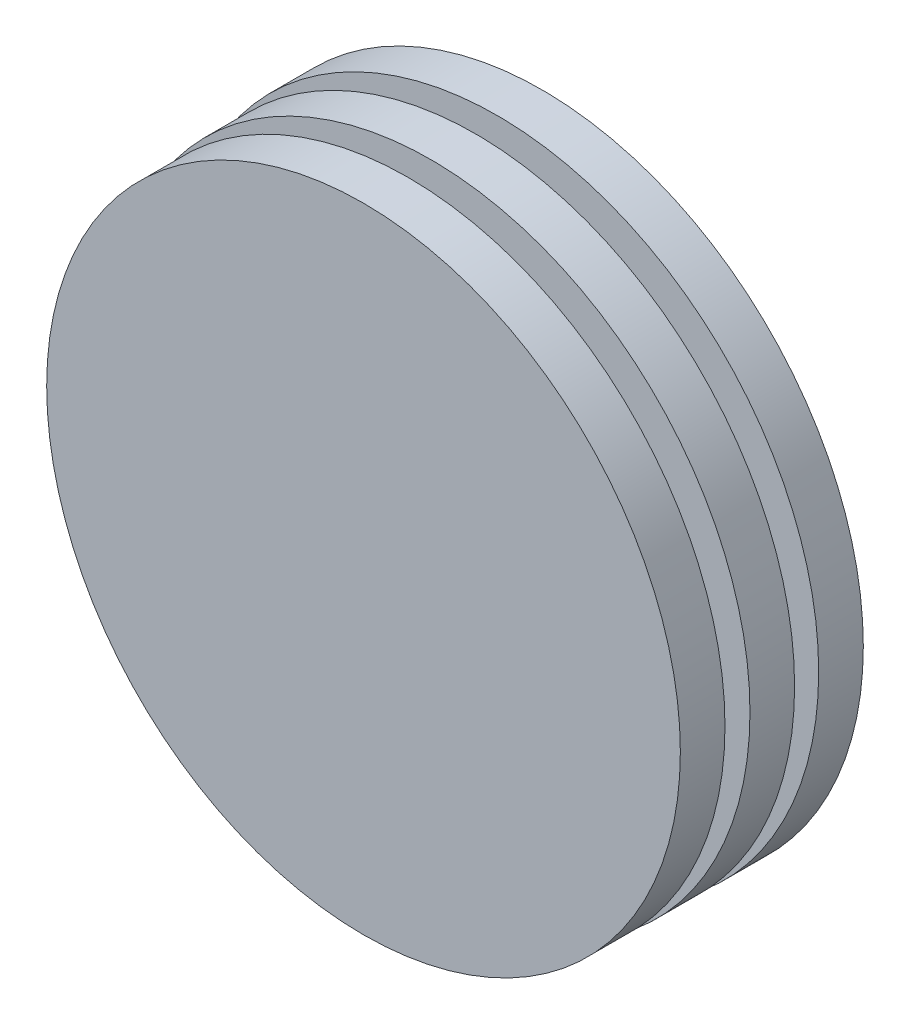
ISO-10303-21;
HEADER;
FILE_DESCRIPTION(('STEP AP214'),'2;1');
FILE_NAME('part.step','',(''),(''),'','','');
FILE_SCHEMA(('AUTOMOTIVE_DESIGN { 1 0 10303 214 1 1 1 1 }'));
ENDSEC;
DATA;
#1=APPLICATION_CONTEXT('core data for automotive mechanical design processes');
#2=APPLICATION_PROTOCOL_DEFINITION('international standard','automotive_design',2000,#1);
#3=PRODUCT_CONTEXT('',#1,'mechanical');
#4=PRODUCT('Part','Part','',(#3));
#5=PRODUCT_RELATED_PRODUCT_CATEGORY('part','',(#4));
#6=PRODUCT_DEFINITION_FORMATION('','',#4);
#7=PRODUCT_DEFINITION_CONTEXT('part definition',#1,'design');
#8=PRODUCT_DEFINITION('design','',#6,#7);
#9=PRODUCT_DEFINITION_SHAPE('','',#8);
#10=(LENGTH_UNIT() NAMED_UNIT(*) SI_UNIT(.MILLI.,.METRE.));
#11=(NAMED_UNIT(*) PLANE_ANGLE_UNIT() SI_UNIT($,.RADIAN.));
#12=(NAMED_UNIT(*) SI_UNIT($,.STERADIAN.) SOLID_ANGLE_UNIT());
#13=UNCERTAINTY_MEASURE_WITH_UNIT(LENGTH_MEASURE(1.E-05),#10,'distance_accuracy_value','');
#14=(GEOMETRIC_REPRESENTATION_CONTEXT(3) GLOBAL_UNCERTAINTY_ASSIGNED_CONTEXT((#13)) GLOBAL_UNIT_ASSIGNED_CONTEXT((#10,
#11,#12)) REPRESENTATION_CONTEXT('',''));
#15=CARTESIAN_POINT('',(0.,0.,0.));
#16=DIRECTION('',(0.,0.,1.));
#17=DIRECTION('',(1.,0.,0.));
#18=AXIS2_PLACEMENT_3D('',#15,#16,#17);
#19=CARTESIAN_POINT('',(0.,3.72038560834496,40.));
#20=DIRECTION('',(0.,0.,-1.));
#21=DIRECTION('',(-1.,0.,0.));
#22=AXIS2_PLACEMENT_3D('',#19,#20,#21);
#23=CYLINDRICAL_SURFACE('',#22,71.);
#24=CARTESIAN_POINT('',(0.,3.72038560834496,40.));
#25=DIRECTION('',(0.,0.,1.));
#26=DIRECTION('',(1.,0.,0.));
#27=AXIS2_PLACEMENT_3D('',#24,#25,#26);
#28=CIRCLE('',#27,71.);
#29=CARTESIAN_POINT('',(71.,3.72038560834496,40.));
#30=VERTEX_POINT('',#29);
#31=EDGE_CURVE('E11',#30,#30,#28,.T.);
#32=ORIENTED_EDGE('',*,*,#31,.F.);
#33=EDGE_LOOP('',(#32));
#34=FACE_BOUND('',#33,.T.);
#35=CARTESIAN_POINT('',(0.,3.72038560834496,30.));
#36=DIRECTION('',(0.,0.,1.));
#37=DIRECTION('',(1.,0.,0.));
#38=AXIS2_PLACEMENT_3D('',#35,#36,#37);
#39=CIRCLE('',#38,71.);
#40=CARTESIAN_POINT('',(71.,3.72038560834496,30.));
#41=VERTEX_POINT('',#40);
#42=EDGE_CURVE('E43',#41,#41,#39,.T.);
#43=ORIENTED_EDGE('',*,*,#42,.T.);
#44=EDGE_LOOP('',(#43));
#45=FACE_BOUND('',#44,.T.);
#46=ADVANCED_FACE('F40',(#34,#45),#23,.T.);
#47=CARTESIAN_POINT('',(0.,3.72038560834496,40.));
#48=DIRECTION('',(0.,0.,1.));
#49=DIRECTION('',(1.,0.,0.));
#50=AXIS2_PLACEMENT_3D('',#47,#48,#49);
#51=PLANE('',#50);
#52=ORIENTED_EDGE('',*,*,#31,.T.);
#53=EDGE_LOOP('',(#52));
#54=FACE_BOUND('',#53,.T.);
#55=ADVANCED_FACE('F55',(#54),#51,.T.);
#56=CARTESIAN_POINT('',(0.,3.72038560834496,30.));
#57=DIRECTION('',(0.,0.,1.));
#58=DIRECTION('',(1.,0.,0.));
#59=AXIS2_PLACEMENT_3D('',#56,#57,#58);
#60=PLANE('',#59);
#61=ORIENTED_EDGE('',*,*,#42,.F.);
#62=EDGE_LOOP('',(#61));
#63=FACE_BOUND('',#62,.T.);
#64=ADVANCED_FACE('F53',(#63),#60,.F.);
#65=CLOSED_SHELL('',(#46,#55,#64));
#66=MANIFOLD_SOLID_BREP('B2',#65);
#67=CARTESIAN_POINT('',(0.100658917191581,4.23062262241215,25.));
#68=DIRECTION('',(0.,0.,-1.));
#69=DIRECTION('',(-1.,0.,0.));
#70=AXIS2_PLACEMENT_3D('',#67,#68,#69);
#71=CYLINDRICAL_SURFACE('',#70,71.5);
#72=CARTESIAN_POINT('',(0.100658917191581,4.23062262241215,25.));
#73=DIRECTION('',(0.,0.,1.));
#74=DIRECTION('',(1.,0.,0.));
#75=AXIS2_PLACEMENT_3D('',#72,#73,#74);
#76=CIRCLE('',#75,71.5);
#77=CARTESIAN_POINT('',(71.6006589171916,4.23062262241215,25.));
#78=VERTEX_POINT('',#77);
#79=EDGE_CURVE('E39',#78,#78,#76,.T.);
#80=ORIENTED_EDGE('',*,*,#79,.F.);
#81=EDGE_LOOP('',(#80));
#82=FACE_BOUND('',#81,.T.);
#83=CARTESIAN_POINT('',(0.100658917191581,4.23062262241215,15.));
#84=DIRECTION('',(0.,0.,1.));
#85=DIRECTION('',(1.,0.,0.));
#86=AXIS2_PLACEMENT_3D('',#83,#84,#85);
#87=CIRCLE('',#86,71.5);
#88=CARTESIAN_POINT('',(71.6006589171916,4.23062262241215,15.));
#89=VERTEX_POINT('',#88);
#90=EDGE_CURVE('E91',#89,#89,#87,.T.);
#91=ORIENTED_EDGE('',*,*,#90,.T.);
#92=EDGE_LOOP('',(#91));
#93=FACE_BOUND('',#92,.T.);
#94=ADVANCED_FACE('F88',(#82,#93),#71,.T.);
#95=CARTESIAN_POINT('',(0.100658917191581,4.23062262241215,25.));
#96=DIRECTION('',(0.,0.,1.));
#97=DIRECTION('',(1.,0.,0.));
#98=AXIS2_PLACEMENT_3D('',#95,#96,#97);
#99=PLANE('',#98);
#100=ORIENTED_EDGE('',*,*,#79,.T.);
#101=EDGE_LOOP('',(#100));
#102=FACE_BOUND('',#101,.T.);
#103=ADVANCED_FACE('F103',(#102),#99,.T.);
#104=CARTESIAN_POINT('',(0.100658917191581,4.23062262241215,15.));
#105=DIRECTION('',(0.,0.,1.));
#106=DIRECTION('',(1.,0.,0.));
#107=AXIS2_PLACEMENT_3D('',#104,#105,#106);
#108=PLANE('',#107);
#109=ORIENTED_EDGE('',*,*,#90,.F.);
#110=EDGE_LOOP('',(#109));
#111=FACE_BOUND('',#110,.T.);
#112=ADVANCED_FACE('F101',(#111),#108,.F.);
#113=CLOSED_SHELL('',(#94,#103,#112));
#114=MANIFOLD_SOLID_BREP('B6',#113);
#115=CARTESIAN_POINT('',(0.,4.72038560834496,10.));
#116=DIRECTION('',(0.,0.,-1.));
#117=DIRECTION('',(-1.,0.,0.));
#118=AXIS2_PLACEMENT_3D('',#115,#116,#117);
#119=CYLINDRICAL_SURFACE('',#118,72.);
#120=CARTESIAN_POINT('',(0.,4.72038560834496,10.));
#121=DIRECTION('',(0.,0.,1.));
#122=DIRECTION('',(1.,0.,0.));
#123=AXIS2_PLACEMENT_3D('',#120,#121,#122);
#124=CIRCLE('',#123,72.);
#125=CARTESIAN_POINT('',(72.,4.72038560834496,10.));
#126=VERTEX_POINT('',#125);
#127=EDGE_CURVE('E87',#126,#126,#124,.T.);
#128=ORIENTED_EDGE('',*,*,#127,.F.);
#129=EDGE_LOOP('',(#128));
#130=FACE_BOUND('',#129,.T.);
#131=CARTESIAN_POINT('',(0.,4.72038560834496,0.));
#132=DIRECTION('',(0.,0.,1.));
#133=DIRECTION('',(1.,0.,0.));
#134=AXIS2_PLACEMENT_3D('',#131,#132,#133);
#135=CIRCLE('',#134,72.);
#136=CARTESIAN_POINT('',(72.,4.72038560834496,0.));
#137=VERTEX_POINT('',#136);
#138=EDGE_CURVE('E132',#137,#137,#135,.T.);
#139=ORIENTED_EDGE('',*,*,#138,.T.);
#140=EDGE_LOOP('',(#139));
#141=FACE_BOUND('',#140,.T.);
#142=ADVANCED_FACE('F129',(#130,#141),#119,.T.);
#143=CARTESIAN_POINT('',(0.,4.72038560834496,10.));
#144=DIRECTION('',(0.,0.,1.));
#145=DIRECTION('',(1.,0.,0.));
#146=AXIS2_PLACEMENT_3D('',#143,#144,#145);
#147=PLANE('',#146);
#148=ORIENTED_EDGE('',*,*,#127,.T.);
#149=EDGE_LOOP('',(#148));
#150=FACE_BOUND('',#149,.T.);
#151=ADVANCED_FACE('F144',(#150),#147,.T.);
#152=CARTESIAN_POINT('',(0.,4.72038560834496,0.));
#153=DIRECTION('',(0.,0.,1.));
#154=DIRECTION('',(1.,0.,0.));
#155=AXIS2_PLACEMENT_3D('',#152,#153,#154);
#156=PLANE('',#155);
#157=ORIENTED_EDGE('',*,*,#138,.F.);
#158=EDGE_LOOP('',(#157));
#159=FACE_BOUND('',#158,.T.);
#160=ADVANCED_FACE('F142',(#159),#156,.F.);
#161=CLOSED_SHELL('',(#142,#151,#160));
#162=MANIFOLD_SOLID_BREP('B34',#161);
#163=ADVANCED_BREP_SHAPE_REPRESENTATION('',(#18,#66,#114,#162),#14);
#164=SHAPE_DEFINITION_REPRESENTATION(#9,#163);
ENDSEC;
END-ISO-10303-21;
